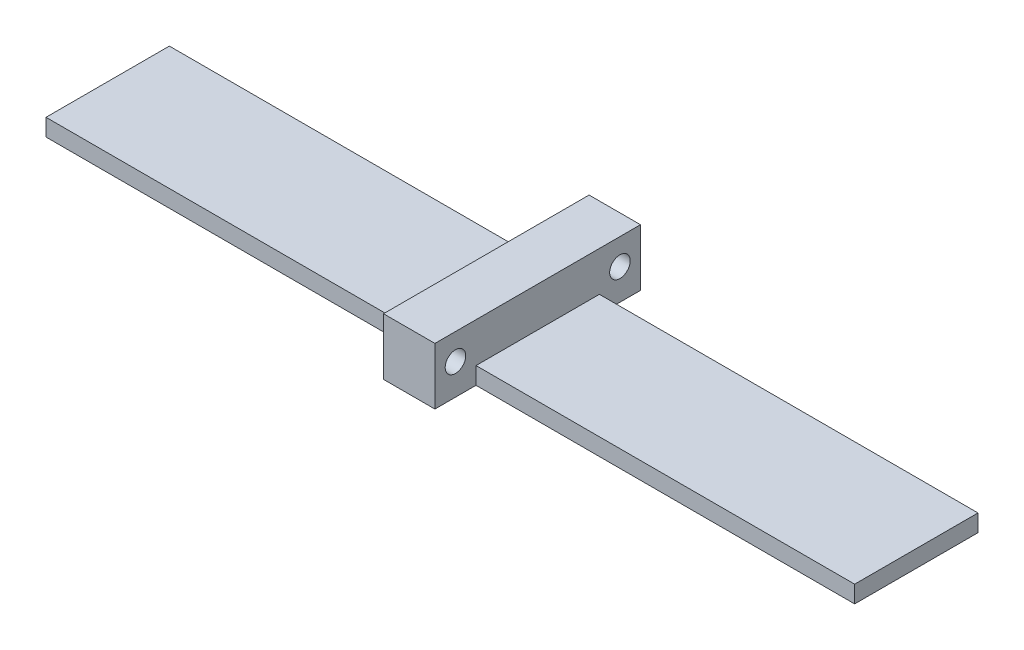
ISO-10303-21;
HEADER;
FILE_DESCRIPTION(('STEP AP214'),'2;1');
FILE_NAME('part.step','',(''),(''),'','','');
FILE_SCHEMA(('AUTOMOTIVE_DESIGN { 1 0 10303 214 1 1 1 1 }'));
ENDSEC;
DATA;
#1=APPLICATION_CONTEXT('core data for automotive mechanical design processes');
#2=APPLICATION_PROTOCOL_DEFINITION('international standard','automotive_design',2000,#1);
#3=PRODUCT_CONTEXT('',#1,'mechanical');
#4=PRODUCT('Part','Part','',(#3));
#5=PRODUCT_RELATED_PRODUCT_CATEGORY('part','',(#4));
#6=PRODUCT_DEFINITION_FORMATION('','',#4);
#7=PRODUCT_DEFINITION_CONTEXT('part definition',#1,'design');
#8=PRODUCT_DEFINITION('design','',#6,#7);
#9=PRODUCT_DEFINITION_SHAPE('','',#8);
#10=(LENGTH_UNIT() NAMED_UNIT(*) SI_UNIT(.MILLI.,.METRE.));
#11=(NAMED_UNIT(*) PLANE_ANGLE_UNIT() SI_UNIT($,.RADIAN.));
#12=(NAMED_UNIT(*) SI_UNIT($,.STERADIAN.) SOLID_ANGLE_UNIT());
#13=UNCERTAINTY_MEASURE_WITH_UNIT(LENGTH_MEASURE(1.E-05),#10,'distance_accuracy_value','');
#14=(GEOMETRIC_REPRESENTATION_CONTEXT(3) GLOBAL_UNCERTAINTY_ASSIGNED_CONTEXT((#13)) GLOBAL_UNIT_ASSIGNED_CONTEXT((#10,
#11,#12)) REPRESENTATION_CONTEXT('',''));
#15=CARTESIAN_POINT('',(0.,0.,0.));
#16=DIRECTION('',(0.,0.,1.));
#17=DIRECTION('',(1.,0.,0.));
#18=AXIS2_PLACEMENT_3D('',#15,#16,#17);
#19=CARTESIAN_POINT('',(9.52500000000001,6.35,22.86));
#20=DIRECTION('',(0.,1.,0.));
#21=DIRECTION('',(0.,0.,1.));
#22=AXIS2_PLACEMENT_3D('',#19,#20,#21);
#23=PLANE('',#22);
#24=DIRECTION('',(0.,0.,1.));
#25=VECTOR('',#24,1.);
#26=CARTESIAN_POINT('',(-149.86,6.35,22.86));
#27=LINE('',#26,#25);
#28=CARTESIAN_POINT('',(-149.86,6.35,-22.86));
#29=VERTEX_POINT('',#28);
#30=CARTESIAN_POINT('',(-149.86,6.35,22.86));
#31=VERTEX_POINT('',#30);
#32=EDGE_CURVE('E133',#29,#31,#27,.T.);
#33=ORIENTED_EDGE('',*,*,#32,.T.);
#34=DIRECTION('',(1.,0.,0.));
#35=VECTOR('',#34,1.);
#36=CARTESIAN_POINT('',(-149.86,6.35,22.86));
#37=LINE('',#36,#35);
#38=CARTESIAN_POINT('',(149.86,6.35,22.86));
#39=VERTEX_POINT('',#38);
#40=EDGE_CURVE('E118',#31,#39,#37,.T.);
#41=ORIENTED_EDGE('',*,*,#40,.T.);
#42=DIRECTION('',(0.,0.,-1.));
#43=VECTOR('',#42,1.);
#44=CARTESIAN_POINT('',(149.86,6.35,22.86));
#45=LINE('',#44,#43);
#46=CARTESIAN_POINT('',(149.86,6.35,-22.86));
#47=VERTEX_POINT('',#46);
#48=EDGE_CURVE('E60',#39,#47,#45,.T.);
#49=ORIENTED_EDGE('',*,*,#48,.T.);
#50=DIRECTION('',(-1.,0.,0.));
#51=VECTOR('',#50,1.);
#52=CARTESIAN_POINT('',(-149.86,6.35,-22.86));
#53=LINE('',#52,#51);
#54=EDGE_CURVE('E92',#47,#29,#53,.T.);
#55=ORIENTED_EDGE('',*,*,#54,.T.);
#56=EDGE_LOOP('',(#33,#41,#49,#55));
#57=FACE_BOUND('',#56,.T.);
#58=ADVANCED_FACE('F56',(#57),#23,.T.);
#59=CARTESIAN_POINT('',(9.52500000000001,0.,22.86));
#60=DIRECTION('',(0.,0.,1.));
#61=DIRECTION('',(1.,0.,0.));
#62=AXIS2_PLACEMENT_3D('',#59,#60,#61);
#63=PLANE('',#62);
#64=ORIENTED_EDGE('',*,*,#40,.F.);
#65=DIRECTION('',(0.,-1.,0.));
#66=VECTOR('',#65,1.);
#67=CARTESIAN_POINT('',(-149.86,6.35,22.86));
#68=LINE('',#67,#66);
#69=CARTESIAN_POINT('',(-149.86,0.,22.86));
#70=VERTEX_POINT('',#69);
#71=EDGE_CURVE('E113',#31,#70,#68,.T.);
#72=ORIENTED_EDGE('',*,*,#71,.T.);
#73=DIRECTION('',(1.,0.,0.));
#74=VECTOR('',#73,1.);
#75=CARTESIAN_POINT('',(-149.86,0.,22.86));
#76=LINE('',#75,#74);
#77=CARTESIAN_POINT('',(149.86,0.,22.86));
#78=VERTEX_POINT('',#77);
#79=EDGE_CURVE('E102',#70,#78,#76,.T.);
#80=ORIENTED_EDGE('',*,*,#79,.T.);
#81=DIRECTION('',(0.,-1.,0.));
#82=VECTOR('',#81,1.);
#83=CARTESIAN_POINT('',(149.86,6.35,22.86));
#84=LINE('',#83,#82);
#85=EDGE_CURVE('E120',#39,#78,#84,.T.);
#86=ORIENTED_EDGE('',*,*,#85,.F.);
#87=EDGE_LOOP('',(#64,#72,#80,#86));
#88=FACE_BOUND('',#87,.T.);
#89=ADVANCED_FACE('F117',(#88),#63,.T.);
#90=CARTESIAN_POINT('',(9.52500000000001,6.35,-22.86));
#91=DIRECTION('',(0.,0.,-1.));
#92=DIRECTION('',(-1.,0.,0.));
#93=AXIS2_PLACEMENT_3D('',#90,#91,#92);
#94=PLANE('',#93);
#95=DIRECTION('',(0.,-1.,0.));
#96=VECTOR('',#95,1.);
#97=CARTESIAN_POINT('',(149.86,6.35,-22.86));
#98=LINE('',#97,#96);
#99=CARTESIAN_POINT('',(149.86,0.,-22.86));
#100=VERTEX_POINT('',#99);
#101=EDGE_CURVE('E125',#47,#100,#98,.T.);
#102=ORIENTED_EDGE('',*,*,#101,.T.);
#103=DIRECTION('',(-1.,0.,0.));
#104=VECTOR('',#103,1.);
#105=CARTESIAN_POINT('',(-149.86,0.,-22.86));
#106=LINE('',#105,#104);
#107=CARTESIAN_POINT('',(-149.86,0.,-22.86));
#108=VERTEX_POINT('',#107);
#109=EDGE_CURVE('E67',#100,#108,#106,.T.);
#110=ORIENTED_EDGE('',*,*,#109,.T.);
#111=DIRECTION('',(0.,-1.,0.));
#112=VECTOR('',#111,1.);
#113=CARTESIAN_POINT('',(-149.86,6.35,-22.86));
#114=LINE('',#113,#112);
#115=EDGE_CURVE('E114',#29,#108,#114,.T.);
#116=ORIENTED_EDGE('',*,*,#115,.F.);
#117=ORIENTED_EDGE('',*,*,#54,.F.);
#118=EDGE_LOOP('',(#102,#110,#116,#117));
#119=FACE_BOUND('',#118,.T.);
#120=ADVANCED_FACE('F142',(#119),#94,.T.);
#121=CARTESIAN_POINT('',(0.,0.,0.));
#122=DIRECTION('',(0.,-1.,0.));
#123=DIRECTION('',(0.,0.,-1.));
#124=AXIS2_PLACEMENT_3D('',#121,#122,#123);
#125=PLANE('',#124);
#126=ORIENTED_EDGE('',*,*,#79,.F.);
#127=DIRECTION('',(0.,0.,1.));
#128=VECTOR('',#127,1.);
#129=CARTESIAN_POINT('',(-149.86,0.,22.86));
#130=LINE('',#129,#128);
#131=EDGE_CURVE('E105',#108,#70,#130,.T.);
#132=ORIENTED_EDGE('',*,*,#131,.F.);
#133=ORIENTED_EDGE('',*,*,#109,.F.);
#134=DIRECTION('',(0.,0.,-1.));
#135=VECTOR('',#134,1.);
#136=CARTESIAN_POINT('',(149.86,0.,22.86));
#137=LINE('',#136,#135);
#138=EDGE_CURVE('E13',#78,#100,#137,.T.);
#139=ORIENTED_EDGE('',*,*,#138,.F.);
#140=EDGE_LOOP('',(#126,#132,#133,#139));
#141=FACE_BOUND('',#140,.T.);
#142=ADVANCED_FACE('F58',(#141),#125,.T.);
#143=CARTESIAN_POINT('',(149.86,6.35,22.86));
#144=DIRECTION('',(-1.,0.,0.));
#145=DIRECTION('',(0.,0.,1.));
#146=AXIS2_PLACEMENT_3D('',#143,#144,#145);
#147=PLANE('',#146);
#148=ORIENTED_EDGE('',*,*,#138,.T.);
#149=ORIENTED_EDGE('',*,*,#101,.F.);
#150=ORIENTED_EDGE('',*,*,#48,.F.);
#151=ORIENTED_EDGE('',*,*,#85,.T.);
#152=EDGE_LOOP('',(#148,#149,#150,#151));
#153=FACE_BOUND('',#152,.T.);
#154=ADVANCED_FACE('F140',(#153),#147,.F.);
#155=CARTESIAN_POINT('',(-149.86,6.35,22.86));
#156=DIRECTION('',(1.,0.,0.));
#157=DIRECTION('',(0.,0.,-1.));
#158=AXIS2_PLACEMENT_3D('',#155,#156,#157);
#159=PLANE('',#158);
#160=ORIENTED_EDGE('',*,*,#131,.T.);
#161=ORIENTED_EDGE('',*,*,#71,.F.);
#162=ORIENTED_EDGE('',*,*,#32,.F.);
#163=ORIENTED_EDGE('',*,*,#115,.T.);
#164=EDGE_LOOP('',(#160,#161,#162,#163));
#165=FACE_BOUND('',#164,.T.);
#166=ADVANCED_FACE('F111',(#165),#159,.F.);
#167=CLOSED_SHELL('',(#58,#89,#120,#142,#154,#166));
#168=MANIFOLD_SOLID_BREP('B2',#167);
#169=CARTESIAN_POINT('',(9.52500000000001,6.35,22.86));
#170=DIRECTION('',(0.,1.,0.));
#171=DIRECTION('',(0.,0.,1.));
#172=AXIS2_PLACEMENT_3D('',#169,#170,#171);
#173=PLANE('',#172);
#174=DIRECTION('',(1.,0.,0.));
#175=VECTOR('',#174,1.);
#176=CARTESIAN_POINT('',(9.52500000000001,6.35,22.86));
#177=LINE('',#176,#175);
#178=CARTESIAN_POINT('',(-9.525,6.35,22.86));
#179=VERTEX_POINT('',#178);
#180=CARTESIAN_POINT('',(9.525,6.35,22.86));
#181=VERTEX_POINT('',#180);
#182=EDGE_CURVE('E273',#179,#181,#177,.T.);
#183=ORIENTED_EDGE('',*,*,#182,.F.);
#184=DIRECTION('',(0.,0.,1.));
#185=VECTOR('',#184,1.);
#186=CARTESIAN_POINT('',(-9.525,6.35,0.));
#187=LINE('',#186,#185);
#188=CARTESIAN_POINT('',(-9.525,6.35,-22.86));
#189=VERTEX_POINT('',#188);
#190=EDGE_CURVE('E212',#189,#179,#187,.T.);
#191=ORIENTED_EDGE('',*,*,#190,.F.);
#192=DIRECTION('',(-1.,0.,0.));
#193=VECTOR('',#192,1.);
#194=CARTESIAN_POINT('',(9.52500000000001,6.35,-22.86));
#195=LINE('',#194,#193);
#196=CARTESIAN_POINT('',(9.52500000000001,6.35,-22.86));
#197=VERTEX_POINT('',#196);
#198=EDGE_CURVE('E324',#197,#189,#195,.T.);
#199=ORIENTED_EDGE('',*,*,#198,.F.);
#200=DIRECTION('',(0.,0.,-1.));
#201=VECTOR('',#200,1.);
#202=CARTESIAN_POINT('',(9.525,6.35,0.));
#203=LINE('',#202,#201);
#204=EDGE_CURVE('E54',#181,#197,#203,.T.);
#205=ORIENTED_EDGE('',*,*,#204,.F.);
#206=EDGE_LOOP('',(#183,#191,#199,#205));
#207=FACE_BOUND('',#206,.T.);
#208=ADVANCED_FACE('F204',(#207),#173,.F.);
#209=CARTESIAN_POINT('',(-9.525,21.082,38.1));
#210=DIRECTION('',(1.,0.,0.));
#211=DIRECTION('',(0.,0.,-1.));
#212=AXIS2_PLACEMENT_3D('',#209,#210,#211);
#213=PLANE('',#212);
#214=CARTESIAN_POINT('',(-9.525,11.43,30.48));
#215=DIRECTION('',(1.,0.,0.));
#216=DIRECTION('',(0.,0.,-1.));
#217=AXIS2_PLACEMENT_3D('',#214,#215,#216);
#218=CIRCLE('',#217,3.81);
#219=CARTESIAN_POINT('',(-9.525,11.43,26.67));
#220=VERTEX_POINT('',#219);
#221=EDGE_CURVE('E285',#220,#220,#218,.F.);
#222=ORIENTED_EDGE('',*,*,#221,.F.);
#223=EDGE_LOOP('',(#222));
#224=FACE_BOUND('',#223,.T.);
#225=CARTESIAN_POINT('',(-9.525,11.43,-30.48));
#226=DIRECTION('',(1.,0.,0.));
#227=DIRECTION('',(0.,0.,-1.));
#228=AXIS2_PLACEMENT_3D('',#225,#226,#227);
#229=CIRCLE('',#228,3.81);
#230=CARTESIAN_POINT('',(-9.525,11.43,-34.29));
#231=VERTEX_POINT('',#230);
#232=EDGE_CURVE('E336',#231,#231,#229,.F.);
#233=ORIENTED_EDGE('',*,*,#232,.F.);
#234=EDGE_LOOP('',(#233));
#235=FACE_BOUND('',#234,.T.);
#236=ORIENTED_EDGE('',*,*,#190,.T.);
#237=DIRECTION('',(0.,-1.,0.));
#238=VECTOR('',#237,1.);
#239=CARTESIAN_POINT('',(-9.525,21.082,22.86));
#240=LINE('',#239,#238);
#241=CARTESIAN_POINT('',(-9.52500000000001,0.,22.86));
#242=VERTEX_POINT('',#241);
#243=EDGE_CURVE('E275',#179,#242,#240,.T.);
#244=ORIENTED_EDGE('',*,*,#243,.T.);
#245=DIRECTION('',(0.,0.,1.));
#246=VECTOR('',#245,1.);
#247=CARTESIAN_POINT('',(-9.525,0.,38.1));
#248=LINE('',#247,#246);
#249=CARTESIAN_POINT('',(-9.525,0.,38.1));
#250=VERTEX_POINT('',#249);
#251=EDGE_CURVE('E283',#242,#250,#248,.T.);
#252=ORIENTED_EDGE('',*,*,#251,.T.);
#253=DIRECTION('',(0.,-1.,0.));
#254=VECTOR('',#253,1.);
#255=CARTESIAN_POINT('',(-9.525,21.082,38.1));
#256=LINE('',#255,#254);
#257=CARTESIAN_POINT('',(-9.525,21.082,38.1));
#258=VERTEX_POINT('',#257);
#259=EDGE_CURVE('E296',#258,#250,#256,.T.);
#260=ORIENTED_EDGE('',*,*,#259,.F.);
#261=DIRECTION('',(0.,0.,1.));
#262=VECTOR('',#261,1.);
#263=CARTESIAN_POINT('',(-9.525,21.082,38.1));
#264=LINE('',#263,#262);
#265=CARTESIAN_POINT('',(-9.525,21.082,-38.1));
#266=VERTEX_POINT('',#265);
#267=EDGE_CURVE('E329',#266,#258,#264,.T.);
#268=ORIENTED_EDGE('',*,*,#267,.F.);
#269=DIRECTION('',(0.,-1.,0.));
#270=VECTOR('',#269,1.);
#271=CARTESIAN_POINT('',(-9.525,21.082,-38.1));
#272=LINE('',#271,#270);
#273=CARTESIAN_POINT('',(-9.525,0.,-38.1));
#274=VERTEX_POINT('',#273);
#275=EDGE_CURVE('E318',#266,#274,#272,.T.);
#276=ORIENTED_EDGE('',*,*,#275,.T.);
#277=DIRECTION('',(0.,0.,1.));
#278=VECTOR('',#277,1.);
#279=CARTESIAN_POINT('',(-9.525,0.,38.1));
#280=LINE('',#279,#278);
#281=CARTESIAN_POINT('',(-9.52500000000001,0.,-22.86));
#282=VERTEX_POINT('',#281);
#283=EDGE_CURVE('E304',#274,#282,#280,.T.);
#284=ORIENTED_EDGE('',*,*,#283,.T.);
#285=DIRECTION('',(0.,1.,0.));
#286=VECTOR('',#285,1.);
#287=CARTESIAN_POINT('',(-9.525,21.082,-22.86));
#288=LINE('',#287,#286);
#289=EDGE_CURVE('E319',#282,#189,#288,.T.);
#290=ORIENTED_EDGE('',*,*,#289,.T.);
#291=EDGE_LOOP('',(#236,#244,#252,#260,#268,#276,#284,#290));
#292=FACE_BOUND('',#291,.T.);
#293=ADVANCED_FACE('F349',(#224,#235,#292),#213,.F.);
#294=CARTESIAN_POINT('',(9.525,21.082,38.1));
#295=DIRECTION('',(-1.,0.,0.));
#296=DIRECTION('',(0.,0.,1.));
#297=AXIS2_PLACEMENT_3D('',#294,#295,#296);
#298=PLANE('',#297);
#299=CARTESIAN_POINT('',(9.525,11.43,30.48));
#300=DIRECTION('',(-1.,0.,0.));
#301=DIRECTION('',(0.,0.,1.));
#302=AXIS2_PLACEMENT_3D('',#299,#300,#301);
#303=CIRCLE('',#302,3.81);
#304=CARTESIAN_POINT('',(9.525,11.43,34.29));
#305=VERTEX_POINT('',#304);
#306=EDGE_CURVE('E207',#305,#305,#303,.F.);
#307=ORIENTED_EDGE('',*,*,#306,.F.);
#308=EDGE_LOOP('',(#307));
#309=FACE_BOUND('',#308,.T.);
#310=CARTESIAN_POINT('',(9.525,11.43,-30.48));
#311=DIRECTION('',(-1.,0.,0.));
#312=DIRECTION('',(0.,0.,1.));
#313=AXIS2_PLACEMENT_3D('',#310,#311,#312);
#314=CIRCLE('',#313,3.81);
#315=CARTESIAN_POINT('',(9.525,11.43,-26.67));
#316=VERTEX_POINT('',#315);
#317=EDGE_CURVE('E334',#316,#316,#314,.F.);
#318=ORIENTED_EDGE('',*,*,#317,.F.);
#319=EDGE_LOOP('',(#318));
#320=FACE_BOUND('',#319,.T.);
#321=DIRECTION('',(0.,0.,-1.));
#322=VECTOR('',#321,1.);
#323=CARTESIAN_POINT('',(9.525,21.082,38.1));
#324=LINE('',#323,#322);
#325=CARTESIAN_POINT('',(9.525,21.082,38.1));
#326=VERTEX_POINT('',#325);
#327=CARTESIAN_POINT('',(9.525,21.082,-38.1));
#328=VERTEX_POINT('',#327);
#329=EDGE_CURVE('E327',#326,#328,#324,.T.);
#330=ORIENTED_EDGE('',*,*,#329,.F.);
#331=DIRECTION('',(0.,-1.,0.));
#332=VECTOR('',#331,1.);
#333=CARTESIAN_POINT('',(9.525,21.082,38.1));
#334=LINE('',#333,#332);
#335=CARTESIAN_POINT('',(9.525,0.,38.1));
#336=VERTEX_POINT('',#335);
#337=EDGE_CURVE('E289',#326,#336,#334,.T.);
#338=ORIENTED_EDGE('',*,*,#337,.T.);
#339=DIRECTION('',(0.,0.,-1.));
#340=VECTOR('',#339,1.);
#341=CARTESIAN_POINT('',(9.525,0.,38.1));
#342=LINE('',#341,#340);
#343=CARTESIAN_POINT('',(9.52500000000001,0.,22.86));
#344=VERTEX_POINT('',#343);
#345=EDGE_CURVE('E276',#336,#344,#342,.T.);
#346=ORIENTED_EDGE('',*,*,#345,.T.);
#347=DIRECTION('',(0.,1.,0.));
#348=VECTOR('',#347,1.);
#349=CARTESIAN_POINT('',(9.525,21.082,22.86));
#350=LINE('',#349,#348);
#351=EDGE_CURVE('E267',#344,#181,#350,.T.);
#352=ORIENTED_EDGE('',*,*,#351,.T.);
#353=ORIENTED_EDGE('',*,*,#204,.T.);
#354=DIRECTION('',(0.,-1.,0.));
#355=VECTOR('',#354,1.);
#356=CARTESIAN_POINT('',(9.525,21.082,-22.86));
#357=LINE('',#356,#355);
#358=CARTESIAN_POINT('',(9.52500000000001,0.,-22.86));
#359=VERTEX_POINT('',#358);
#360=EDGE_CURVE('E313',#197,#359,#357,.T.);
#361=ORIENTED_EDGE('',*,*,#360,.T.);
#362=DIRECTION('',(0.,0.,-1.));
#363=VECTOR('',#362,1.);
#364=CARTESIAN_POINT('',(9.525,0.,38.1));
#365=LINE('',#364,#363);
#366=CARTESIAN_POINT('',(9.525,0.,-38.1));
#367=VERTEX_POINT('',#366);
#368=EDGE_CURVE('E310',#359,#367,#365,.T.);
#369=ORIENTED_EDGE('',*,*,#368,.T.);
#370=DIRECTION('',(0.,-1.,0.));
#371=VECTOR('',#370,1.);
#372=CARTESIAN_POINT('',(9.525,21.082,-38.1));
#373=LINE('',#372,#371);
#374=EDGE_CURVE('E316',#328,#367,#373,.T.);
#375=ORIENTED_EDGE('',*,*,#374,.F.);
#376=EDGE_LOOP('',(#330,#338,#346,#352,#353,#361,#369,#375));
#377=FACE_BOUND('',#376,.T.);
#378=ADVANCED_FACE('F287',(#309,#320,#377),#298,.F.);
#379=CARTESIAN_POINT('',(0.,21.082,0.));
#380=DIRECTION('',(0.,-1.,0.));
#381=DIRECTION('',(0.,0.,-1.));
#382=AXIS2_PLACEMENT_3D('',#379,#380,#381);
#383=PLANE('',#382);
#384=ORIENTED_EDGE('',*,*,#267,.T.);
#385=DIRECTION('',(1.,0.,0.));
#386=VECTOR('',#385,1.);
#387=CARTESIAN_POINT('',(-9.525,21.082,38.1));
#388=LINE('',#387,#386);
#389=EDGE_CURVE('E299',#258,#326,#388,.T.);
#390=ORIENTED_EDGE('',*,*,#389,.T.);
#391=ORIENTED_EDGE('',*,*,#329,.T.);
#392=DIRECTION('',(-1.,0.,0.));
#393=VECTOR('',#392,1.);
#394=CARTESIAN_POINT('',(-9.525,21.082,-38.1));
#395=LINE('',#394,#393);
#396=EDGE_CURVE('E321',#328,#266,#395,.T.);
#397=ORIENTED_EDGE('',*,*,#396,.T.);
#398=EDGE_LOOP('',(#384,#390,#391,#397));
#399=FACE_BOUND('',#398,.T.);
#400=ADVANCED_FACE('F358',(#399),#383,.F.);
#401=CARTESIAN_POINT('',(9.52500000000001,6.35,-22.86));
#402=DIRECTION('',(0.,0.,-1.));
#403=DIRECTION('',(-1.,0.,0.));
#404=AXIS2_PLACEMENT_3D('',#401,#402,#403);
#405=PLANE('',#404);
#406=ORIENTED_EDGE('',*,*,#360,.F.);
#407=ORIENTED_EDGE('',*,*,#198,.T.);
#408=ORIENTED_EDGE('',*,*,#289,.F.);
#409=DIRECTION('',(1.,0.,0.));
#410=VECTOR('',#409,1.);
#411=CARTESIAN_POINT('',(0.,0.,-22.86));
#412=LINE('',#411,#410);
#413=EDGE_CURVE('E302',#282,#359,#412,.T.);
#414=ORIENTED_EDGE('',*,*,#413,.T.);
#415=EDGE_LOOP('',(#406,#407,#408,#414));
#416=FACE_BOUND('',#415,.T.);
#417=ADVANCED_FACE('F353',(#416),#405,.F.);
#418=CARTESIAN_POINT('',(-9.525,21.082,-38.1));
#419=DIRECTION('',(0.,0.,1.));
#420=DIRECTION('',(1.,0.,0.));
#421=AXIS2_PLACEMENT_3D('',#418,#419,#420);
#422=PLANE('',#421);
#423=ORIENTED_EDGE('',*,*,#374,.T.);
#424=DIRECTION('',(-1.,0.,0.));
#425=VECTOR('',#424,1.);
#426=CARTESIAN_POINT('',(-9.525,0.,-38.1));
#427=LINE('',#426,#425);
#428=EDGE_CURVE('E307',#367,#274,#427,.T.);
#429=ORIENTED_EDGE('',*,*,#428,.T.);
#430=ORIENTED_EDGE('',*,*,#275,.F.);
#431=ORIENTED_EDGE('',*,*,#396,.F.);
#432=EDGE_LOOP('',(#423,#429,#430,#431));
#433=FACE_BOUND('',#432,.T.);
#434=ADVANCED_FACE('F363',(#433),#422,.F.);
#435=CARTESIAN_POINT('',(0.,0.,0.));
#436=DIRECTION('',(0.,-1.,0.));
#437=DIRECTION('',(0.,0.,-1.));
#438=AXIS2_PLACEMENT_3D('',#435,#436,#437);
#439=PLANE('',#438);
#440=ORIENTED_EDGE('',*,*,#413,.F.);
#441=ORIENTED_EDGE('',*,*,#283,.F.);
#442=ORIENTED_EDGE('',*,*,#428,.F.);
#443=ORIENTED_EDGE('',*,*,#368,.F.);
#444=EDGE_LOOP('',(#440,#441,#442,#443));
#445=FACE_BOUND('',#444,.T.);
#446=ADVANCED_FACE('F370',(#445),#439,.T.);
#447=CARTESIAN_POINT('',(9.52500000000001,0.,22.86));
#448=DIRECTION('',(0.,0.,1.));
#449=DIRECTION('',(1.,0.,0.));
#450=AXIS2_PLACEMENT_3D('',#447,#448,#449);
#451=PLANE('',#450);
#452=ORIENTED_EDGE('',*,*,#243,.F.);
#453=ORIENTED_EDGE('',*,*,#182,.T.);
#454=ORIENTED_EDGE('',*,*,#351,.F.);
#455=DIRECTION('',(-1.,0.,0.));
#456=VECTOR('',#455,1.);
#457=CARTESIAN_POINT('',(0.,0.,22.86));
#458=LINE('',#457,#456);
#459=EDGE_CURVE('E271',#344,#242,#458,.T.);
#460=ORIENTED_EDGE('',*,*,#459,.T.);
#461=EDGE_LOOP('',(#452,#453,#454,#460));
#462=FACE_BOUND('',#461,.T.);
#463=ADVANCED_FACE('F270',(#462),#451,.F.);
#464=CARTESIAN_POINT('',(-9.525,21.082,38.1));
#465=DIRECTION('',(0.,0.,-1.));
#466=DIRECTION('',(-1.,0.,0.));
#467=AXIS2_PLACEMENT_3D('',#464,#465,#466);
#468=PLANE('',#467);
#469=ORIENTED_EDGE('',*,*,#259,.T.);
#470=DIRECTION('',(1.,0.,0.));
#471=VECTOR('',#470,1.);
#472=CARTESIAN_POINT('',(-9.525,0.,38.1));
#473=LINE('',#472,#471);
#474=EDGE_CURVE('E284',#250,#336,#473,.T.);
#475=ORIENTED_EDGE('',*,*,#474,.T.);
#476=ORIENTED_EDGE('',*,*,#337,.F.);
#477=ORIENTED_EDGE('',*,*,#389,.F.);
#478=EDGE_LOOP('',(#469,#475,#476,#477));
#479=FACE_BOUND('',#478,.T.);
#480=ADVANCED_FACE('F381',(#479),#468,.F.);
#481=CARTESIAN_POINT('',(0.,0.,0.));
#482=DIRECTION('',(0.,-1.,0.));
#483=DIRECTION('',(0.,0.,-1.));
#484=AXIS2_PLACEMENT_3D('',#481,#482,#483);
#485=PLANE('',#484);
#486=ORIENTED_EDGE('',*,*,#459,.F.);
#487=ORIENTED_EDGE('',*,*,#345,.F.);
#488=ORIENTED_EDGE('',*,*,#474,.F.);
#489=ORIENTED_EDGE('',*,*,#251,.F.);
#490=EDGE_LOOP('',(#486,#487,#488,#489));
#491=FACE_BOUND('',#490,.T.);
#492=ADVANCED_FACE('F280',(#491),#485,.T.);
#493=CARTESIAN_POINT('',(19.05,11.43,-30.48));
#494=DIRECTION('',(-1.,0.,0.));
#495=DIRECTION('',(0.,0.,1.));
#496=AXIS2_PLACEMENT_3D('',#493,#494,#495);
#497=CYLINDRICAL_SURFACE('',#496,3.81);
#498=ORIENTED_EDGE('',*,*,#317,.T.);
#499=EDGE_LOOP('',(#498));
#500=FACE_BOUND('',#499,.T.);
#501=ORIENTED_EDGE('',*,*,#232,.T.);
#502=EDGE_LOOP('',(#501));
#503=FACE_BOUND('',#502,.T.);
#504=ADVANCED_FACE('F387',(#500,#503),#497,.F.);
#505=CARTESIAN_POINT('',(19.05,11.43,30.48));
#506=DIRECTION('',(-1.,0.,0.));
#507=DIRECTION('',(0.,0.,1.));
#508=AXIS2_PLACEMENT_3D('',#505,#506,#507);
#509=CYLINDRICAL_SURFACE('',#508,3.81);
#510=ORIENTED_EDGE('',*,*,#306,.T.);
#511=EDGE_LOOP('',(#510));
#512=FACE_BOUND('',#511,.T.);
#513=ORIENTED_EDGE('',*,*,#221,.T.);
#514=EDGE_LOOP('',(#513));
#515=FACE_BOUND('',#514,.T.);
#516=ADVANCED_FACE('F347',(#512,#515),#509,.F.);
#517=CLOSED_SHELL('',(#208,#293,#378,#400,#417,#434,#446,#463,#480,#492,#504,#516));
#518=MANIFOLD_SOLID_BREP('B7',#517);
#519=ADVANCED_BREP_SHAPE_REPRESENTATION('',(#18,#168,#518),#14);
#520=SHAPE_DEFINITION_REPRESENTATION(#9,#519);
ENDSEC;
END-ISO-10303-21;
